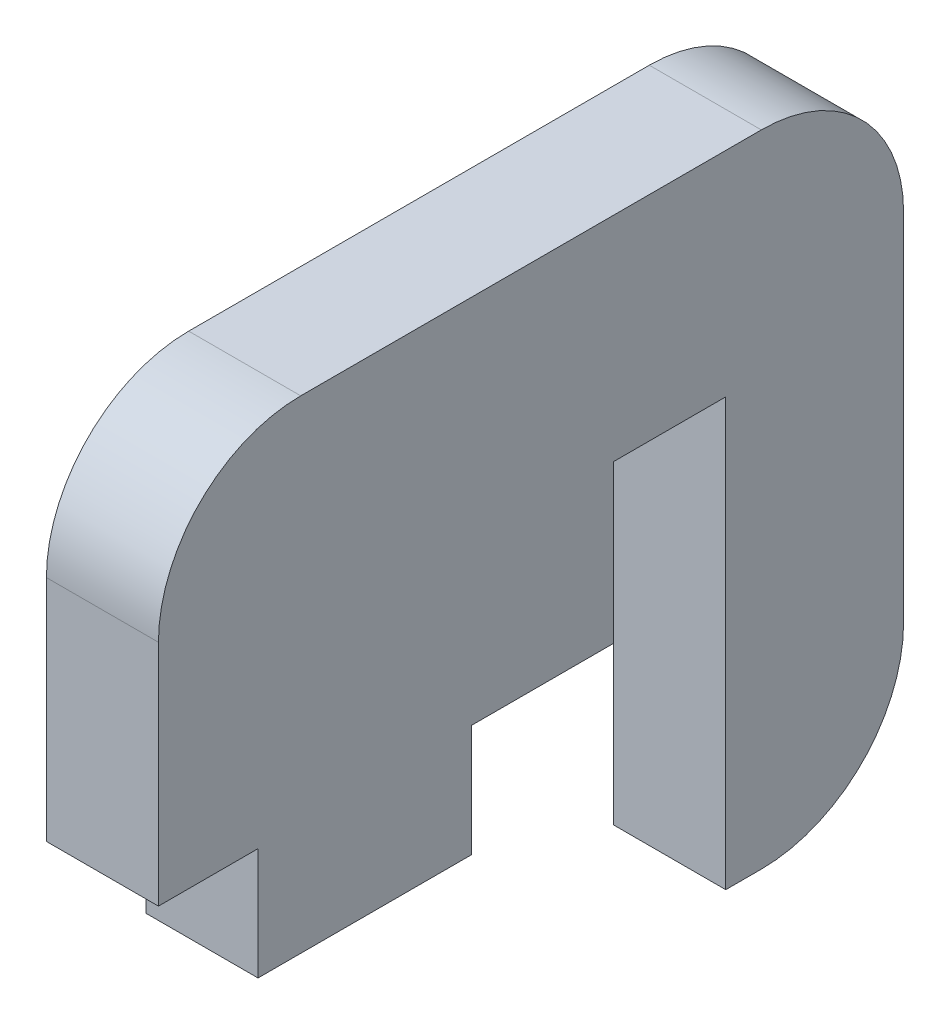
ISO-10303-21;
HEADER;
FILE_DESCRIPTION(('STEP AP214'),'2;1');
FILE_NAME('part.step','',(''),(''),'','','');
FILE_SCHEMA(('AUTOMOTIVE_DESIGN { 1 0 10303 214 1 1 1 1 }'));
ENDSEC;
DATA;
#1=APPLICATION_CONTEXT('core data for automotive mechanical design processes');
#2=APPLICATION_PROTOCOL_DEFINITION('international standard','automotive_design',2000,#1);
#3=PRODUCT_CONTEXT('',#1,'mechanical');
#4=PRODUCT('Part','Part','',(#3));
#5=PRODUCT_RELATED_PRODUCT_CATEGORY('part','',(#4));
#6=PRODUCT_DEFINITION_FORMATION('','',#4);
#7=PRODUCT_DEFINITION_CONTEXT('part definition',#1,'design');
#8=PRODUCT_DEFINITION('design','',#6,#7);
#9=PRODUCT_DEFINITION_SHAPE('','',#8);
#10=(LENGTH_UNIT() NAMED_UNIT(*) SI_UNIT(.MILLI.,.METRE.));
#11=(NAMED_UNIT(*) PLANE_ANGLE_UNIT() SI_UNIT($,.RADIAN.));
#12=(NAMED_UNIT(*) SI_UNIT($,.STERADIAN.) SOLID_ANGLE_UNIT());
#13=UNCERTAINTY_MEASURE_WITH_UNIT(LENGTH_MEASURE(1.E-05),#10,'distance_accuracy_value','');
#14=(GEOMETRIC_REPRESENTATION_CONTEXT(3) GLOBAL_UNCERTAINTY_ASSIGNED_CONTEXT((#13)) GLOBAL_UNIT_ASSIGNED_CONTEXT((#10,
#11,#12)) REPRESENTATION_CONTEXT('',''));
#15=CARTESIAN_POINT('',(0.,0.,0.));
#16=DIRECTION('',(0.,0.,1.));
#17=DIRECTION('',(1.,0.,0.));
#18=AXIS2_PLACEMENT_3D('',#15,#16,#17);
#19=CARTESIAN_POINT('',(4.,0.,-7.62));
#20=DIRECTION('',(0.,1.,0.));
#21=DIRECTION('',(0.,0.,1.));
#22=AXIS2_PLACEMENT_3D('',#19,#20,#21);
#23=PLANE('',#22);
#24=DIRECTION('',(0.,0.,-1.));
#25=VECTOR('',#24,1.);
#26=CARTESIAN_POINT('',(0.,0.,-7.62));
#27=LINE('',#26,#25);
#28=CARTESIAN_POINT('',(0.,0.,0.));
#29=VERTEX_POINT('',#28);
#30=CARTESIAN_POINT('',(0.,0.,-7.62));
#31=VERTEX_POINT('',#30);
#32=EDGE_CURVE('E188',#29,#31,#27,.T.);
#33=ORIENTED_EDGE('',*,*,#32,.T.);
#34=DIRECTION('',(-1.,0.,0.));
#35=VECTOR('',#34,1.);
#36=CARTESIAN_POINT('',(4.,0.,-7.62));
#37=LINE('',#36,#35);
#38=CARTESIAN_POINT('',(4.,0.,-7.62));
#39=VERTEX_POINT('',#38);
#40=EDGE_CURVE('E11',#39,#31,#37,.T.);
#41=ORIENTED_EDGE('',*,*,#40,.F.);
#42=DIRECTION('',(0.,0.,-1.));
#43=VECTOR('',#42,1.);
#44=CARTESIAN_POINT('',(4.,0.,-7.62));
#45=LINE('',#44,#43);
#46=CARTESIAN_POINT('',(4.,0.,0.));
#47=VERTEX_POINT('',#46);
#48=EDGE_CURVE('E231',#47,#39,#45,.T.);
#49=ORIENTED_EDGE('',*,*,#48,.F.);
#50=DIRECTION('',(-1.,0.,0.));
#51=VECTOR('',#50,1.);
#52=CARTESIAN_POINT('',(4.,0.,0.));
#53=LINE('',#52,#51);
#54=EDGE_CURVE('E184',#47,#29,#53,.T.);
#55=ORIENTED_EDGE('',*,*,#54,.T.);
#56=EDGE_LOOP('',(#33,#41,#49,#55));
#57=FACE_BOUND('',#56,.T.);
#58=ADVANCED_FACE('F45',(#57),#23,.F.);
#59=CARTESIAN_POINT('',(4.,4.,-7.62));
#60=DIRECTION('',(0.,0.,1.));
#61=DIRECTION('',(0.,-1.,0.));
#62=AXIS2_PLACEMENT_3D('',#59,#60,#61);
#63=PLANE('',#62);
#64=DIRECTION('',(0.,1.,0.));
#65=VECTOR('',#64,1.);
#66=CARTESIAN_POINT('',(0.,4.,-7.62));
#67=LINE('',#66,#65);
#68=CARTESIAN_POINT('',(0.,4.,-7.62));
#69=VERTEX_POINT('',#68);
#70=EDGE_CURVE('E192',#31,#69,#67,.T.);
#71=ORIENTED_EDGE('',*,*,#70,.T.);
#72=DIRECTION('',(-1.,0.,0.));
#73=VECTOR('',#72,1.);
#74=CARTESIAN_POINT('',(4.,4.,-7.62));
#75=LINE('',#74,#73);
#76=CARTESIAN_POINT('',(4.,4.,-7.62));
#77=VERTEX_POINT('',#76);
#78=EDGE_CURVE('E54',#77,#69,#75,.T.);
#79=ORIENTED_EDGE('',*,*,#78,.F.);
#80=DIRECTION('',(0.,1.,0.));
#81=VECTOR('',#80,1.);
#82=CARTESIAN_POINT('',(4.,4.,-7.62));
#83=LINE('',#82,#81);
#84=EDGE_CURVE('E126',#39,#77,#83,.T.);
#85=ORIENTED_EDGE('',*,*,#84,.F.);
#86=ORIENTED_EDGE('',*,*,#40,.T.);
#87=EDGE_LOOP('',(#71,#79,#85,#86));
#88=FACE_BOUND('',#87,.T.);
#89=ADVANCED_FACE('F346',(#88),#63,.F.);
#90=CARTESIAN_POINT('',(4.,4.,-12.7));
#91=DIRECTION('',(0.,1.,0.));
#92=DIRECTION('',(0.,0.,1.));
#93=AXIS2_PLACEMENT_3D('',#90,#91,#92);
#94=PLANE('',#93);
#95=DIRECTION('',(0.,0.,-1.));
#96=VECTOR('',#95,1.);
#97=CARTESIAN_POINT('',(0.,4.,-12.7));
#98=LINE('',#97,#96);
#99=CARTESIAN_POINT('',(0.,4.,-12.7));
#100=VERTEX_POINT('',#99);
#101=EDGE_CURVE('E195',#69,#100,#98,.T.);
#102=ORIENTED_EDGE('',*,*,#101,.T.);
#103=DIRECTION('',(-1.,0.,0.));
#104=VECTOR('',#103,1.);
#105=CARTESIAN_POINT('',(4.,4.,-12.7));
#106=LINE('',#105,#104);
#107=CARTESIAN_POINT('',(4.,4.,-12.7));
#108=VERTEX_POINT('',#107);
#109=EDGE_CURVE('E270',#108,#100,#106,.T.);
#110=ORIENTED_EDGE('',*,*,#109,.F.);
#111=DIRECTION('',(0.,0.,-1.));
#112=VECTOR('',#111,1.);
#113=CARTESIAN_POINT('',(4.,4.,-12.7));
#114=LINE('',#113,#112);
#115=EDGE_CURVE('E280',#77,#108,#114,.T.);
#116=ORIENTED_EDGE('',*,*,#115,.F.);
#117=ORIENTED_EDGE('',*,*,#78,.T.);
#118=EDGE_LOOP('',(#102,#110,#116,#117));
#119=FACE_BOUND('',#118,.T.);
#120=ADVANCED_FACE('F278',(#119),#94,.F.);
#121=CARTESIAN_POINT('',(4.,9.62,-12.7));
#122=DIRECTION('',(0.,0.,1.));
#123=DIRECTION('',(0.,-1.,0.));
#124=AXIS2_PLACEMENT_3D('',#121,#122,#123);
#125=PLANE('',#124);
#126=DIRECTION('',(0.,1.,0.));
#127=VECTOR('',#126,1.);
#128=CARTESIAN_POINT('',(0.,9.62,-12.7));
#129=LINE('',#128,#127);
#130=CARTESIAN_POINT('',(0.,9.62,-12.7));
#131=VERTEX_POINT('',#130);
#132=EDGE_CURVE('E198',#100,#131,#129,.T.);
#133=ORIENTED_EDGE('',*,*,#132,.T.);
#134=DIRECTION('',(-1.,0.,0.));
#135=VECTOR('',#134,1.);
#136=CARTESIAN_POINT('',(4.,9.62,-12.7));
#137=LINE('',#136,#135);
#138=CARTESIAN_POINT('',(4.,9.62,-12.7));
#139=VERTEX_POINT('',#138);
#140=EDGE_CURVE('E266',#139,#131,#137,.T.);
#141=ORIENTED_EDGE('',*,*,#140,.F.);
#142=DIRECTION('',(0.,1.,0.));
#143=VECTOR('',#142,1.);
#144=CARTESIAN_POINT('',(4.,9.62,-12.7));
#145=LINE('',#144,#143);
#146=EDGE_CURVE('E299',#108,#139,#145,.T.);
#147=ORIENTED_EDGE('',*,*,#146,.F.);
#148=ORIENTED_EDGE('',*,*,#109,.T.);
#149=EDGE_LOOP('',(#133,#141,#147,#148));
#150=FACE_BOUND('',#149,.T.);
#151=ADVANCED_FACE('F289',(#150),#125,.F.);
#152=CARTESIAN_POINT('',(4.,9.62,-16.7));
#153=DIRECTION('',(0.,1.,0.));
#154=DIRECTION('',(0.,0.,1.));
#155=AXIS2_PLACEMENT_3D('',#152,#153,#154);
#156=PLANE('',#155);
#157=DIRECTION('',(0.,0.,-1.));
#158=VECTOR('',#157,1.);
#159=CARTESIAN_POINT('',(0.,9.62,-16.7));
#160=LINE('',#159,#158);
#161=CARTESIAN_POINT('',(0.,9.62,-16.7));
#162=VERTEX_POINT('',#161);
#163=EDGE_CURVE('E201',#131,#162,#160,.T.);
#164=ORIENTED_EDGE('',*,*,#163,.T.);
#165=DIRECTION('',(-1.,0.,0.));
#166=VECTOR('',#165,1.);
#167=CARTESIAN_POINT('',(4.,9.62,-16.7));
#168=LINE('',#167,#166);
#169=CARTESIAN_POINT('',(4.,9.62,-16.7));
#170=VERTEX_POINT('',#169);
#171=EDGE_CURVE('E262',#170,#162,#168,.T.);
#172=ORIENTED_EDGE('',*,*,#171,.F.);
#173=DIRECTION('',(0.,0.,-1.));
#174=VECTOR('',#173,1.);
#175=CARTESIAN_POINT('',(4.,9.62,-16.7));
#176=LINE('',#175,#174);
#177=EDGE_CURVE('E295',#139,#170,#176,.T.);
#178=ORIENTED_EDGE('',*,*,#177,.F.);
#179=ORIENTED_EDGE('',*,*,#140,.T.);
#180=EDGE_LOOP('',(#164,#172,#178,#179));
#181=FACE_BOUND('',#180,.T.);
#182=ADVANCED_FACE('F293',(#181),#156,.F.);
#183=CARTESIAN_POINT('',(4.,-5.62,-16.7));
#184=DIRECTION('',(0.,0.,-1.));
#185=DIRECTION('',(-1.,0.,0.));
#186=AXIS2_PLACEMENT_3D('',#183,#184,#185);
#187=PLANE('',#186);
#188=DIRECTION('',(0.,-1.,0.));
#189=VECTOR('',#188,1.);
#190=CARTESIAN_POINT('',(0.,-5.62,-16.7));
#191=LINE('',#190,#189);
#192=CARTESIAN_POINT('',(0.,-5.62,-16.7));
#193=VERTEX_POINT('',#192);
#194=EDGE_CURVE('E204',#162,#193,#191,.T.);
#195=ORIENTED_EDGE('',*,*,#194,.T.);
#196=DIRECTION('',(-1.,0.,0.));
#197=VECTOR('',#196,1.);
#198=CARTESIAN_POINT('',(4.,-5.62,-16.7));
#199=LINE('',#198,#197);
#200=CARTESIAN_POINT('',(4.,-5.62,-16.7));
#201=VERTEX_POINT('',#200);
#202=EDGE_CURVE('E258',#201,#193,#199,.T.);
#203=ORIENTED_EDGE('',*,*,#202,.F.);
#204=DIRECTION('',(0.,-1.,0.));
#205=VECTOR('',#204,1.);
#206=CARTESIAN_POINT('',(4.,-5.62,-16.7));
#207=LINE('',#206,#205);
#208=EDGE_CURVE('E298',#170,#201,#207,.T.);
#209=ORIENTED_EDGE('',*,*,#208,.F.);
#210=ORIENTED_EDGE('',*,*,#171,.T.);
#211=EDGE_LOOP('',(#195,#203,#209,#210));
#212=FACE_BOUND('',#211,.T.);
#213=ADVANCED_FACE('F359',(#212),#187,.F.);
#214=CARTESIAN_POINT('',(4.,-5.62,-17.97));
#215=DIRECTION('',(0.,1.,0.));
#216=DIRECTION('',(0.,0.,1.));
#217=AXIS2_PLACEMENT_3D('',#214,#215,#216);
#218=PLANE('',#217);
#219=DIRECTION('',(0.,0.,-1.));
#220=VECTOR('',#219,1.);
#221=CARTESIAN_POINT('',(0.,-5.62,-17.97));
#222=LINE('',#221,#220);
#223=CARTESIAN_POINT('',(0.,-5.62,-17.97));
#224=VERTEX_POINT('',#223);
#225=EDGE_CURVE('E207',#193,#224,#222,.T.);
#226=ORIENTED_EDGE('',*,*,#225,.T.);
#227=DIRECTION('',(-1.,0.,0.));
#228=VECTOR('',#227,1.);
#229=CARTESIAN_POINT('',(4.,-5.62,-17.97));
#230=LINE('',#229,#228);
#231=CARTESIAN_POINT('',(4.,-5.62,-17.97));
#232=VERTEX_POINT('',#231);
#233=EDGE_CURVE('E254',#232,#224,#230,.T.);
#234=ORIENTED_EDGE('',*,*,#233,.F.);
#235=DIRECTION('',(0.,0.,-1.));
#236=VECTOR('',#235,1.);
#237=CARTESIAN_POINT('',(4.,-5.62,-17.97));
#238=LINE('',#237,#236);
#239=EDGE_CURVE('E303',#201,#232,#238,.T.);
#240=ORIENTED_EDGE('',*,*,#239,.F.);
#241=ORIENTED_EDGE('',*,*,#202,.T.);
#242=EDGE_LOOP('',(#226,#234,#240,#241));
#243=FACE_BOUND('',#242,.T.);
#244=ADVANCED_FACE('F362',(#243),#218,.F.);
#245=CARTESIAN_POINT('',(4.,-0.54,-17.97));
#246=DIRECTION('',(-1.,0.,0.));
#247=DIRECTION('',(0.,0.,1.));
#248=AXIS2_PLACEMENT_3D('',#245,#246,#247);
#249=CYLINDRICAL_SURFACE('',#248,5.08);
#250=CARTESIAN_POINT('',(0.,-0.54,-17.97));
#251=DIRECTION('',(1.,0.,0.));
#252=DIRECTION('',(0.,0.,1.));
#253=AXIS2_PLACEMENT_3D('',#250,#251,#252);
#254=CIRCLE('',#253,5.08);
#255=CARTESIAN_POINT('',(0.,-0.539999999999962,-23.05));
#256=VERTEX_POINT('',#255);
#257=EDGE_CURVE('E210',#224,#256,#254,.T.);
#258=ORIENTED_EDGE('',*,*,#257,.T.);
#259=DIRECTION('',(-1.,0.,0.));
#260=VECTOR('',#259,1.);
#261=CARTESIAN_POINT('',(4.,-0.539999999999962,-23.05));
#262=LINE('',#261,#260);
#263=CARTESIAN_POINT('',(4.,-0.539999999999962,-23.05));
#264=VERTEX_POINT('',#263);
#265=EDGE_CURVE('E250',#264,#256,#262,.T.);
#266=ORIENTED_EDGE('',*,*,#265,.F.);
#267=CARTESIAN_POINT('',(4.,-0.54,-17.97));
#268=DIRECTION('',(1.,0.,0.));
#269=DIRECTION('',(0.,0.,1.));
#270=AXIS2_PLACEMENT_3D('',#267,#268,#269);
#271=CIRCLE('',#270,5.08);
#272=EDGE_CURVE('E310',#232,#264,#271,.T.);
#273=ORIENTED_EDGE('',*,*,#272,.F.);
#274=ORIENTED_EDGE('',*,*,#233,.T.);
#275=EDGE_LOOP('',(#258,#266,#273,#274));
#276=FACE_BOUND('',#275,.T.);
#277=ADVANCED_FACE('F366',(#276),#249,.T.);
#278=CARTESIAN_POINT('',(4.,12.16,-23.05));
#279=DIRECTION('',(0.,0.,1.));
#280=DIRECTION('',(0.,-1.,0.));
#281=AXIS2_PLACEMENT_3D('',#278,#279,#280);
#282=PLANE('',#281);
#283=DIRECTION('',(0.,1.,0.));
#284=VECTOR('',#283,1.);
#285=CARTESIAN_POINT('',(0.,12.16,-23.05));
#286=LINE('',#285,#284);
#287=CARTESIAN_POINT('',(0.,12.16,-23.05));
#288=VERTEX_POINT('',#287);
#289=EDGE_CURVE('E213',#256,#288,#286,.T.);
#290=ORIENTED_EDGE('',*,*,#289,.T.);
#291=DIRECTION('',(-1.,0.,0.));
#292=VECTOR('',#291,1.);
#293=CARTESIAN_POINT('',(4.,12.16,-23.05));
#294=LINE('',#293,#292);
#295=CARTESIAN_POINT('',(4.,12.16,-23.05));
#296=VERTEX_POINT('',#295);
#297=EDGE_CURVE('E246',#296,#288,#294,.T.);
#298=ORIENTED_EDGE('',*,*,#297,.F.);
#299=DIRECTION('',(0.,1.,0.));
#300=VECTOR('',#299,1.);
#301=CARTESIAN_POINT('',(4.,12.16,-23.05));
#302=LINE('',#301,#300);
#303=EDGE_CURVE('E313',#264,#296,#302,.T.);
#304=ORIENTED_EDGE('',*,*,#303,.F.);
#305=ORIENTED_EDGE('',*,*,#265,.T.);
#306=EDGE_LOOP('',(#290,#298,#304,#305));
#307=FACE_BOUND('',#306,.T.);
#308=ADVANCED_FACE('F370',(#307),#282,.F.);
#309=CARTESIAN_POINT('',(4.,12.16,-17.97));
#310=DIRECTION('',(-1.,0.,0.));
#311=DIRECTION('',(0.,0.,1.));
#312=AXIS2_PLACEMENT_3D('',#309,#310,#311);
#313=CYLINDRICAL_SURFACE('',#312,5.08);
#314=CARTESIAN_POINT('',(0.,12.16,-17.97));
#315=DIRECTION('',(1.,0.,0.));
#316=DIRECTION('',(0.,0.,1.));
#317=AXIS2_PLACEMENT_3D('',#314,#315,#316);
#318=CIRCLE('',#317,5.08);
#319=CARTESIAN_POINT('',(0.,17.24,-17.97));
#320=VERTEX_POINT('',#319);
#321=EDGE_CURVE('E216',#288,#320,#318,.T.);
#322=ORIENTED_EDGE('',*,*,#321,.T.);
#323=DIRECTION('',(-1.,0.,0.));
#324=VECTOR('',#323,1.);
#325=CARTESIAN_POINT('',(4.,17.24,-17.97));
#326=LINE('',#325,#324);
#327=CARTESIAN_POINT('',(4.,17.24,-17.97));
#328=VERTEX_POINT('',#327);
#329=EDGE_CURVE('E242',#328,#320,#326,.T.);
#330=ORIENTED_EDGE('',*,*,#329,.F.);
#331=CARTESIAN_POINT('',(4.,12.16,-17.97));
#332=DIRECTION('',(1.,0.,0.));
#333=DIRECTION('',(0.,0.,1.));
#334=AXIS2_PLACEMENT_3D('',#331,#332,#333);
#335=CIRCLE('',#334,5.08);
#336=EDGE_CURVE('E316',#296,#328,#335,.T.);
#337=ORIENTED_EDGE('',*,*,#336,.F.);
#338=ORIENTED_EDGE('',*,*,#297,.T.);
#339=EDGE_LOOP('',(#322,#330,#337,#338));
#340=FACE_BOUND('',#339,.T.);
#341=ADVANCED_FACE('F374',(#340),#313,.T.);
#342=CARTESIAN_POINT('',(4.,17.24,-1.52400000000003));
#343=DIRECTION('',(0.,-1.,0.));
#344=DIRECTION('',(0.,0.,-1.));
#345=AXIS2_PLACEMENT_3D('',#342,#343,#344);
#346=PLANE('',#345);
#347=DIRECTION('',(0.,0.,1.));
#348=VECTOR('',#347,1.);
#349=CARTESIAN_POINT('',(0.,17.24,-1.52400000000003));
#350=LINE('',#349,#348);
#351=CARTESIAN_POINT('',(0.,17.24,-1.52400000000004));
#352=VERTEX_POINT('',#351);
#353=EDGE_CURVE('E219',#320,#352,#350,.T.);
#354=ORIENTED_EDGE('',*,*,#353,.T.);
#355=DIRECTION('',(-1.,0.,0.));
#356=VECTOR('',#355,1.);
#357=CARTESIAN_POINT('',(4.,17.24,-1.52400000000004));
#358=LINE('',#357,#356);
#359=CARTESIAN_POINT('',(4.,17.24,-1.52400000000004));
#360=VERTEX_POINT('',#359);
#361=EDGE_CURVE('E238',#360,#352,#358,.T.);
#362=ORIENTED_EDGE('',*,*,#361,.F.);
#363=DIRECTION('',(0.,0.,1.));
#364=VECTOR('',#363,1.);
#365=CARTESIAN_POINT('',(4.,17.24,-1.52400000000003));
#366=LINE('',#365,#364);
#367=EDGE_CURVE('E319',#328,#360,#366,.T.);
#368=ORIENTED_EDGE('',*,*,#367,.F.);
#369=ORIENTED_EDGE('',*,*,#329,.T.);
#370=EDGE_LOOP('',(#354,#362,#368,#369));
#371=FACE_BOUND('',#370,.T.);
#372=ADVANCED_FACE('F327',(#371),#346,.F.);
#373=CARTESIAN_POINT('',(4.,12.16,-1.524));
#374=DIRECTION('',(-1.,0.,0.));
#375=DIRECTION('',(0.,0.,1.));
#376=AXIS2_PLACEMENT_3D('',#373,#374,#375);
#377=CYLINDRICAL_SURFACE('',#376,5.08);
#378=CARTESIAN_POINT('',(0.,12.16,-1.524));
#379=DIRECTION('',(1.,0.,0.));
#380=DIRECTION('',(0.,0.,1.));
#381=AXIS2_PLACEMENT_3D('',#378,#379,#380);
#382=CIRCLE('',#381,5.08);
#383=CARTESIAN_POINT('',(0.,12.16,3.556));
#384=VERTEX_POINT('',#383);
#385=EDGE_CURVE('E222',#352,#384,#382,.T.);
#386=ORIENTED_EDGE('',*,*,#385,.T.);
#387=DIRECTION('',(-1.,0.,0.));
#388=VECTOR('',#387,1.);
#389=CARTESIAN_POINT('',(4.,12.16,3.556));
#390=LINE('',#389,#388);
#391=CARTESIAN_POINT('',(4.,12.16,3.556));
#392=VERTEX_POINT('',#391);
#393=EDGE_CURVE('E177',#392,#384,#390,.T.);
#394=ORIENTED_EDGE('',*,*,#393,.F.);
#395=CARTESIAN_POINT('',(4.,12.16,-1.524));
#396=DIRECTION('',(1.,0.,0.));
#397=DIRECTION('',(0.,0.,1.));
#398=AXIS2_PLACEMENT_3D('',#395,#396,#397);
#399=CIRCLE('',#398,5.08);
#400=EDGE_CURVE('E166',#360,#392,#399,.T.);
#401=ORIENTED_EDGE('',*,*,#400,.F.);
#402=ORIENTED_EDGE('',*,*,#361,.T.);
#403=EDGE_LOOP('',(#386,#394,#401,#402));
#404=FACE_BOUND('',#403,.T.);
#405=ADVANCED_FACE('F331',(#404),#377,.T.);
#406=CARTESIAN_POINT('',(4.,4.,3.556));
#407=DIRECTION('',(0.,0.,-1.));
#408=DIRECTION('',(-1.,0.,0.));
#409=AXIS2_PLACEMENT_3D('',#406,#407,#408);
#410=PLANE('',#409);
#411=DIRECTION('',(0.,-1.,0.));
#412=VECTOR('',#411,1.);
#413=CARTESIAN_POINT('',(0.,4.,3.556));
#414=LINE('',#413,#412);
#415=CARTESIAN_POINT('',(0.,4.,3.556));
#416=VERTEX_POINT('',#415);
#417=EDGE_CURVE('E175',#384,#416,#414,.T.);
#418=ORIENTED_EDGE('',*,*,#417,.T.);
#419=DIRECTION('',(-1.,0.,0.));
#420=VECTOR('',#419,1.);
#421=CARTESIAN_POINT('',(4.,4.,3.556));
#422=LINE('',#421,#420);
#423=CARTESIAN_POINT('',(4.,4.,3.556));
#424=VERTEX_POINT('',#423);
#425=EDGE_CURVE('E172',#424,#416,#422,.T.);
#426=ORIENTED_EDGE('',*,*,#425,.F.);
#427=DIRECTION('',(0.,-1.,0.));
#428=VECTOR('',#427,1.);
#429=CARTESIAN_POINT('',(4.,4.,3.556));
#430=LINE('',#429,#428);
#431=EDGE_CURVE('E160',#392,#424,#430,.T.);
#432=ORIENTED_EDGE('',*,*,#431,.F.);
#433=ORIENTED_EDGE('',*,*,#393,.T.);
#434=EDGE_LOOP('',(#418,#426,#432,#433));
#435=FACE_BOUND('',#434,.T.);
#436=ADVANCED_FACE('F173',(#435),#410,.F.);
#437=CARTESIAN_POINT('',(4.,4.,0.));
#438=DIRECTION('',(0.,1.,0.));
#439=DIRECTION('',(0.,0.,1.));
#440=AXIS2_PLACEMENT_3D('',#437,#438,#439);
#441=PLANE('',#440);
#442=DIRECTION('',(0.,0.,-1.));
#443=VECTOR('',#442,1.);
#444=CARTESIAN_POINT('',(0.,4.,0.));
#445=LINE('',#444,#443);
#446=CARTESIAN_POINT('',(0.,4.,0.));
#447=VERTEX_POINT('',#446);
#448=EDGE_CURVE('E112',#416,#447,#445,.T.);
#449=ORIENTED_EDGE('',*,*,#448,.T.);
#450=DIRECTION('',(-1.,0.,0.));
#451=VECTOR('',#450,1.);
#452=CARTESIAN_POINT('',(4.,4.,0.));
#453=LINE('',#452,#451);
#454=CARTESIAN_POINT('',(4.,4.,0.));
#455=VERTEX_POINT('',#454);
#456=EDGE_CURVE('E178',#455,#447,#453,.T.);
#457=ORIENTED_EDGE('',*,*,#456,.F.);
#458=DIRECTION('',(0.,0.,-1.));
#459=VECTOR('',#458,1.);
#460=CARTESIAN_POINT('',(4.,4.,0.));
#461=LINE('',#460,#459);
#462=EDGE_CURVE('E164',#424,#455,#461,.T.);
#463=ORIENTED_EDGE('',*,*,#462,.F.);
#464=ORIENTED_EDGE('',*,*,#425,.T.);
#465=EDGE_LOOP('',(#449,#457,#463,#464));
#466=FACE_BOUND('',#465,.T.);
#467=ADVANCED_FACE('F180',(#466),#441,.F.);
#468=CARTESIAN_POINT('',(4.,0.,0.));
#469=DIRECTION('',(0.,0.,-1.));
#470=DIRECTION('',(-1.,0.,0.));
#471=AXIS2_PLACEMENT_3D('',#468,#469,#470);
#472=PLANE('',#471);
#473=DIRECTION('',(0.,-1.,0.));
#474=VECTOR('',#473,1.);
#475=CARTESIAN_POINT('',(0.,0.,0.));
#476=LINE('',#475,#474);
#477=EDGE_CURVE('E118',#447,#29,#476,.T.);
#478=ORIENTED_EDGE('',*,*,#477,.T.);
#479=ORIENTED_EDGE('',*,*,#54,.F.);
#480=DIRECTION('',(0.,-1.,0.));
#481=VECTOR('',#480,1.);
#482=CARTESIAN_POINT('',(4.,0.,0.));
#483=LINE('',#482,#481);
#484=EDGE_CURVE('E62',#455,#47,#483,.T.);
#485=ORIENTED_EDGE('',*,*,#484,.F.);
#486=ORIENTED_EDGE('',*,*,#456,.T.);
#487=EDGE_LOOP('',(#478,#479,#485,#486));
#488=FACE_BOUND('',#487,.T.);
#489=ADVANCED_FACE('F335',(#488),#472,.F.);
#490=CARTESIAN_POINT('',(4.,12.16,-1.524));
#491=DIRECTION('',(-1.,0.,0.));
#492=DIRECTION('',(0.,0.,1.));
#493=AXIS2_PLACEMENT_3D('',#490,#491,#492);
#494=PLANE('',#493);
#495=ORIENTED_EDGE('',*,*,#48,.T.);
#496=ORIENTED_EDGE('',*,*,#84,.T.);
#497=ORIENTED_EDGE('',*,*,#115,.T.);
#498=ORIENTED_EDGE('',*,*,#146,.T.);
#499=ORIENTED_EDGE('',*,*,#177,.T.);
#500=ORIENTED_EDGE('',*,*,#208,.T.);
#501=ORIENTED_EDGE('',*,*,#239,.T.);
#502=ORIENTED_EDGE('',*,*,#272,.T.);
#503=ORIENTED_EDGE('',*,*,#303,.T.);
#504=ORIENTED_EDGE('',*,*,#336,.T.);
#505=ORIENTED_EDGE('',*,*,#367,.T.);
#506=ORIENTED_EDGE('',*,*,#400,.T.);
#507=ORIENTED_EDGE('',*,*,#431,.T.);
#508=ORIENTED_EDGE('',*,*,#462,.T.);
#509=ORIENTED_EDGE('',*,*,#484,.T.);
#510=EDGE_LOOP('',(#495,#496,#497,#498,#499,#500,#501,#502,#503,#504,#505,#506,#507,#508,#509));
#511=FACE_BOUND('',#510,.T.);
#512=ADVANCED_FACE('F162',(#511),#494,.F.);
#513=CARTESIAN_POINT('',(0.,12.16,-1.524));
#514=DIRECTION('',(-1.,0.,0.));
#515=DIRECTION('',(0.,0.,1.));
#516=AXIS2_PLACEMENT_3D('',#513,#514,#515);
#517=PLANE('',#516);
#518=ORIENTED_EDGE('',*,*,#32,.F.);
#519=ORIENTED_EDGE('',*,*,#477,.F.);
#520=ORIENTED_EDGE('',*,*,#448,.F.);
#521=ORIENTED_EDGE('',*,*,#417,.F.);
#522=ORIENTED_EDGE('',*,*,#385,.F.);
#523=ORIENTED_EDGE('',*,*,#353,.F.);
#524=ORIENTED_EDGE('',*,*,#321,.F.);
#525=ORIENTED_EDGE('',*,*,#289,.F.);
#526=ORIENTED_EDGE('',*,*,#257,.F.);
#527=ORIENTED_EDGE('',*,*,#225,.F.);
#528=ORIENTED_EDGE('',*,*,#194,.F.);
#529=ORIENTED_EDGE('',*,*,#163,.F.);
#530=ORIENTED_EDGE('',*,*,#132,.F.);
#531=ORIENTED_EDGE('',*,*,#101,.F.);
#532=ORIENTED_EDGE('',*,*,#70,.F.);
#533=EDGE_LOOP('',(#518,#519,#520,#521,#522,#523,#524,#525,#526,#527,#528,#529,#530,#531,#532));
#534=FACE_BOUND('',#533,.T.);
#535=ADVANCED_FACE('F284',(#534),#517,.T.);
#536=CLOSED_SHELL('',(#58,#89,#120,#151,#182,#213,#244,#277,#308,#341,#372,#405,#436,#467,#489,
#512,#535));
#537=MANIFOLD_SOLID_BREP('B2',#536);
#538=ADVANCED_BREP_SHAPE_REPRESENTATION('',(#18,#537),#14);
#539=SHAPE_DEFINITION_REPRESENTATION(#9,#538);
ENDSEC;
END-ISO-10303-21;
